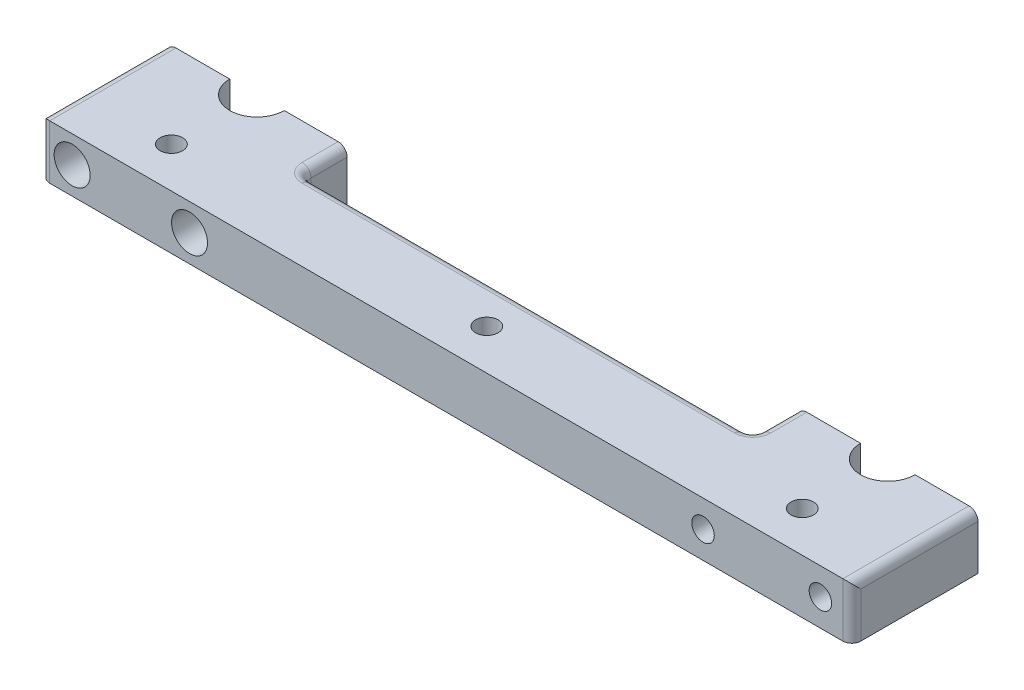
ISO-10303-21;
HEADER;
FILE_DESCRIPTION(('STEP AP214'),'2;1');
FILE_NAME('part.step','',(''),(''),'','','');
FILE_SCHEMA(('AUTOMOTIVE_DESIGN { 1 0 10303 214 1 1 1 1 }'));
ENDSEC;
DATA;
#1=APPLICATION_CONTEXT('core data for automotive mechanical design processes');
#2=APPLICATION_PROTOCOL_DEFINITION('international standard','automotive_design',2000,#1);
#3=PRODUCT_CONTEXT('',#1,'mechanical');
#4=PRODUCT('Part','Part','',(#3));
#5=PRODUCT_RELATED_PRODUCT_CATEGORY('part','',(#4));
#6=PRODUCT_DEFINITION_FORMATION('','',#4);
#7=PRODUCT_DEFINITION_CONTEXT('part definition',#1,'design');
#8=PRODUCT_DEFINITION('design','',#6,#7);
#9=PRODUCT_DEFINITION_SHAPE('','',#8);
#10=(LENGTH_UNIT() NAMED_UNIT(*) SI_UNIT(.MILLI.,.METRE.));
#11=(NAMED_UNIT(*) PLANE_ANGLE_UNIT() SI_UNIT($,.RADIAN.));
#12=(NAMED_UNIT(*) SI_UNIT($,.STERADIAN.) SOLID_ANGLE_UNIT());
#13=UNCERTAINTY_MEASURE_WITH_UNIT(LENGTH_MEASURE(1.E-05),#10,'distance_accuracy_value','');
#14=(GEOMETRIC_REPRESENTATION_CONTEXT(3) GLOBAL_UNCERTAINTY_ASSIGNED_CONTEXT((#13)) GLOBAL_UNIT_ASSIGNED_CONTEXT((#10,
#11,#12)) REPRESENTATION_CONTEXT('',''));
#15=CARTESIAN_POINT('',(0.,0.,0.));
#16=DIRECTION('',(0.,0.,1.));
#17=DIRECTION('',(1.,0.,0.));
#18=AXIS2_PLACEMENT_3D('',#15,#16,#17);
#19=CARTESIAN_POINT('',(8.04453515147499,0.,-47.4021185238704));
#20=DIRECTION('',(0.,0.,1.));
#21=DIRECTION('',(-1.,0.,0.));
#22=AXIS2_PLACEMENT_3D('',#19,#20,#21);
#23=PLANE('',#22);
#24=CARTESIAN_POINT('',(87.0472675757375,6.,-47.4021185238704));
#25=DIRECTION('',(0.,0.,1.));
#26=DIRECTION('',(1.,0.,0.));
#27=AXIS2_PLACEMENT_3D('',#24,#25,#26);
#28=CIRCLE('',#27,2.5);
#29=CARTESIAN_POINT('',(89.5472675757375,6.,-47.4021185238704));
#30=VERTEX_POINT('',#29);
#31=EDGE_CURVE('E387',#30,#30,#28,.T.);
#32=ORIENTED_EDGE('',*,*,#31,.T.);
#33=EDGE_LOOP('',(#32));
#34=FACE_BOUND('',#33,.T.);
#35=DIRECTION('',(-1.,0.,0.));
#36=VECTOR('',#35,1.);
#37=CARTESIAN_POINT('',(94.0222675757375,12.,-47.4021185238704));
#38=LINE('',#37,#36);
#39=CARTESIAN_POINT('',(92.0222675757375,12.,-47.4021185238704));
#40=VERTEX_POINT('',#39);
#41=CARTESIAN_POINT('',(80.0722675757375,12.,-47.4021185238704));
#42=VERTEX_POINT('',#41);
#43=EDGE_CURVE('E198',#40,#42,#38,.T.);
#44=ORIENTED_EDGE('',*,*,#43,.F.);
#45=CARTESIAN_POINT('',(92.0222675757375,10.,-47.4021185238704));
#46=DIRECTION('',(0.,0.,1.));
#47=DIRECTION('',(1.,0.,0.));
#48=AXIS2_PLACEMENT_3D('',#45,#46,#47);
#49=CIRCLE('',#48,2.);
#50=CARTESIAN_POINT('',(94.0222675757375,10.,-47.4021185238704));
#51=VERTEX_POINT('',#50);
#52=EDGE_CURVE('E304',#40,#51,#49,.F.);
#53=ORIENTED_EDGE('',*,*,#52,.T.);
#54=DIRECTION('',(0.,1.,0.));
#55=VECTOR('',#54,1.);
#56=CARTESIAN_POINT('',(94.0222675757375,12.,-47.4021185238704));
#57=LINE('',#56,#55);
#58=CARTESIAN_POINT('',(94.0222675757375,0.,-47.4021185238704));
#59=VERTEX_POINT('',#58);
#60=EDGE_CURVE('E377',#59,#51,#57,.T.);
#61=ORIENTED_EDGE('',*,*,#60,.F.);
#62=DIRECTION('',(1.,0.,0.));
#63=VECTOR('',#62,1.);
#64=CARTESIAN_POINT('',(94.0222675757375,0.,-47.4021185238704));
#65=LINE('',#64,#63);
#66=CARTESIAN_POINT('',(80.0722675757375,0.,-47.4021185238704));
#67=VERTEX_POINT('',#66);
#68=EDGE_CURVE('E374',#67,#59,#65,.T.);
#69=ORIENTED_EDGE('',*,*,#68,.F.);
#70=DIRECTION('',(0.,1.,0.));
#71=VECTOR('',#70,1.);
#72=CARTESIAN_POINT('',(80.0722675757375,0.,-47.4021185238704));
#73=LINE('',#72,#71);
#74=EDGE_CURVE('E186',#42,#67,#73,.F.);
#75=ORIENTED_EDGE('',*,*,#74,.F.);
#76=EDGE_LOOP('',(#44,#53,#61,#69,#75));
#77=FACE_BOUND('',#76,.T.);
#78=ADVANCED_FACE('F35',(#34,#77),#23,.F.);
#79=CARTESIAN_POINT('',(60.9972675757375,6.,-47.4021185238704));
#80=DIRECTION('',(0.,0.,1.));
#81=DIRECTION('',(1.,0.,0.));
#82=AXIS2_PLACEMENT_3D('',#79,#80,#81);
#83=CIRCLE('',#82,2.5);
#84=CARTESIAN_POINT('',(63.4972675757375,6.,-47.4021185238704));
#85=VERTEX_POINT('',#84);
#86=EDGE_CURVE('E381',#85,#85,#83,.T.);
#87=ORIENTED_EDGE('',*,*,#86,.T.);
#88=EDGE_LOOP('',(#87));
#89=FACE_BOUND('',#88,.T.);
#90=DIRECTION('',(0.,-1.,0.));
#91=VECTOR('',#90,1.);
#92=CARTESIAN_POINT('',(54.0222675757375,12.,-47.4021185238704));
#93=LINE('',#92,#91);
#94=CARTESIAN_POINT('',(54.0222675757375,10.,-47.4021185238704));
#95=VERTEX_POINT('',#94);
#96=CARTESIAN_POINT('',(54.0222675757375,0.,-47.4021185238704));
#97=VERTEX_POINT('',#96);
#98=EDGE_CURVE('E205',#95,#97,#93,.T.);
#99=ORIENTED_EDGE('',*,*,#98,.F.);
#100=CARTESIAN_POINT('',(56.0222675757375,10.,-47.4021185238704));
#101=DIRECTION('',(0.,0.,1.));
#102=DIRECTION('',(1.,0.,0.));
#103=AXIS2_PLACEMENT_3D('',#100,#101,#102);
#104=CIRCLE('',#103,2.);
#105=CARTESIAN_POINT('',(56.0222675757375,12.,-47.4021185238704));
#106=VERTEX_POINT('',#105);
#107=EDGE_CURVE('E204',#95,#106,#104,.F.);
#108=ORIENTED_EDGE('',*,*,#107,.T.);
#109=CARTESIAN_POINT('',(67.9722675757375,12.,-47.4021185238704));
#110=VERTEX_POINT('',#109);
#111=EDGE_CURVE('E194',#110,#106,#38,.T.);
#112=ORIENTED_EDGE('',*,*,#111,.F.);
#113=DIRECTION('',(0.,1.,0.));
#114=VECTOR('',#113,1.);
#115=CARTESIAN_POINT('',(67.9722675757375,0.,-47.4021185238704));
#116=LINE('',#115,#114);
#117=CARTESIAN_POINT('',(67.9722675757375,0.,-47.4021185238704));
#118=VERTEX_POINT('',#117);
#119=EDGE_CURVE('E175',#118,#110,#116,.T.);
#120=ORIENTED_EDGE('',*,*,#119,.F.);
#121=EDGE_CURVE('E208',#97,#118,#65,.T.);
#122=ORIENTED_EDGE('',*,*,#121,.F.);
#123=EDGE_LOOP('',(#99,#108,#112,#120,#122));
#124=FACE_BOUND('',#123,.T.);
#125=ADVANCED_FACE('F202',(#89,#124),#23,.F.);
#126=CARTESIAN_POINT('',(-79.0027324242625,6.,-19.4021185238704));
#127=DIRECTION('',(0.,0.,-1.));
#128=DIRECTION('',(-1.,0.,0.));
#129=AXIS2_PLACEMENT_3D('',#126,#127,#128);
#130=CYLINDRICAL_SURFACE('',#129,2.5);
#131=CARTESIAN_POINT('',(-79.0027324242625,6.,-47.4021185238704));
#132=DIRECTION('',(0.,0.,-1.));
#133=DIRECTION('',(-1.,0.,0.));
#134=AXIS2_PLACEMENT_3D('',#131,#132,#133);
#135=CIRCLE('',#134,2.5);
#136=CARTESIAN_POINT('',(-81.5027324242625,6.,-47.4021185238704));
#137=VERTEX_POINT('',#136);
#138=EDGE_CURVE('E228',#137,#137,#135,.T.);
#139=ORIENTED_EDGE('',*,*,#138,.T.);
#140=EDGE_LOOP('',(#139));
#141=FACE_BOUND('',#140,.T.);
#142=CARTESIAN_POINT('',(-79.0027324242625,6.,-31.4021185238704));
#143=DIRECTION('',(0.,0.,1.));
#144=DIRECTION('',(1.,0.,0.));
#145=AXIS2_PLACEMENT_3D('',#142,#143,#144);
#146=CIRCLE('',#145,2.5);
#147=CARTESIAN_POINT('',(-76.5027324242625,6.,-31.4021185238704));
#148=VERTEX_POINT('',#147);
#149=EDGE_CURVE('E218',#148,#148,#146,.F.);
#150=ORIENTED_EDGE('',*,*,#149,.F.);
#151=EDGE_LOOP('',(#150));
#152=FACE_BOUND('',#151,.T.);
#153=ADVANCED_FACE('F449',(#141,#152),#130,.F.);
#154=CARTESIAN_POINT('',(-52.9527324242625,6.,-19.4021185238704));
#155=DIRECTION('',(0.,0.,-1.));
#156=DIRECTION('',(-1.,0.,0.));
#157=AXIS2_PLACEMENT_3D('',#154,#155,#156);
#158=CYLINDRICAL_SURFACE('',#157,2.5);
#159=CARTESIAN_POINT('',(-52.9527324242625,6.,-47.4021185238704));
#160=DIRECTION('',(0.,0.,-1.));
#161=DIRECTION('',(-1.,0.,0.));
#162=AXIS2_PLACEMENT_3D('',#159,#160,#161);
#163=CIRCLE('',#162,2.5);
#164=CARTESIAN_POINT('',(-55.4527324242625,6.,-47.4021185238704));
#165=VERTEX_POINT('',#164);
#166=EDGE_CURVE('E231',#165,#165,#163,.T.);
#167=ORIENTED_EDGE('',*,*,#166,.T.);
#168=EDGE_LOOP('',(#167));
#169=FACE_BOUND('',#168,.T.);
#170=CARTESIAN_POINT('',(-52.9527324242625,6.,-31.4021185238704));
#171=DIRECTION('',(0.,0.,1.));
#172=DIRECTION('',(1.,0.,0.));
#173=AXIS2_PLACEMENT_3D('',#170,#171,#172);
#174=CIRCLE('',#173,2.5);
#175=CARTESIAN_POINT('',(-50.4527324242625,6.,-31.4021185238704));
#176=VERTEX_POINT('',#175);
#177=EDGE_CURVE('E224',#176,#176,#174,.F.);
#178=ORIENTED_EDGE('',*,*,#177,.F.);
#179=EDGE_LOOP('',(#178));
#180=FACE_BOUND('',#179,.T.);
#181=ADVANCED_FACE('F477',(#169,#180),#158,.F.);
#182=CARTESIAN_POINT('',(0.,0.,-47.4021185238704));
#183=DIRECTION('',(0.,0.,1.));
#184=DIRECTION('',(1.,0.,0.));
#185=AXIS2_PLACEMENT_3D('',#182,#183,#184);
#186=PLANE('',#185);
#187=ORIENTED_EDGE('',*,*,#166,.F.);
#188=EDGE_LOOP('',(#187));
#189=FACE_BOUND('',#188,.T.);
#190=DIRECTION('',(1.,0.,0.));
#191=VECTOR('',#190,1.);
#192=CARTESIAN_POINT('',(-85.9777324242625,12.,-47.4021185238704));
#193=LINE('',#192,#191);
#194=CARTESIAN_POINT('',(-59.9277324242625,12.,-47.4021185238704));
#195=VERTEX_POINT('',#194);
#196=CARTESIAN_POINT('',(-47.9777324242625,12.,-47.4021185238704));
#197=VERTEX_POINT('',#196);
#198=EDGE_CURVE('E242',#195,#197,#193,.T.);
#199=ORIENTED_EDGE('',*,*,#198,.T.);
#200=CARTESIAN_POINT('',(-47.9777324242625,10.,-47.4021185238704));
#201=DIRECTION('',(0.,0.,1.));
#202=DIRECTION('',(1.,0.,0.));
#203=AXIS2_PLACEMENT_3D('',#200,#201,#202);
#204=CIRCLE('',#203,2.);
#205=CARTESIAN_POINT('',(-45.9777324242625,10.,-47.4021185238704));
#206=VERTEX_POINT('',#205);
#207=EDGE_CURVE('E314',#197,#206,#204,.F.);
#208=ORIENTED_EDGE('',*,*,#207,.T.);
#209=DIRECTION('',(0.,-1.,0.));
#210=VECTOR('',#209,1.);
#211=CARTESIAN_POINT('',(-45.9777324242625,12.,-47.4021185238704));
#212=LINE('',#211,#210);
#213=CARTESIAN_POINT('',(-45.9777324242625,0.,-47.4021185238704));
#214=VERTEX_POINT('',#213);
#215=EDGE_CURVE('E245',#206,#214,#212,.T.);
#216=ORIENTED_EDGE('',*,*,#215,.T.);
#217=DIRECTION('',(-1.,0.,0.));
#218=VECTOR('',#217,1.);
#219=CARTESIAN_POINT('',(-85.9777324242625,0.,-47.4021185238704));
#220=LINE('',#219,#218);
#221=CARTESIAN_POINT('',(-59.9277324242625,0.,-47.4021185238704));
#222=VERTEX_POINT('',#221);
#223=EDGE_CURVE('E248',#214,#222,#220,.T.);
#224=ORIENTED_EDGE('',*,*,#223,.T.);
#225=DIRECTION('',(0.,1.,0.));
#226=VECTOR('',#225,1.);
#227=CARTESIAN_POINT('',(-59.9277324242625,0.,-47.4021185238704));
#228=LINE('',#227,#226);
#229=EDGE_CURVE('E187',#222,#195,#228,.T.);
#230=ORIENTED_EDGE('',*,*,#229,.T.);
#231=EDGE_LOOP('',(#199,#208,#216,#224,#230));
#232=FACE_BOUND('',#231,.T.);
#233=ADVANCED_FACE('F481',(#189,#232),#186,.F.);
#234=CARTESIAN_POINT('',(-85.9777324242625,12.,-37.4021185238704));
#235=DIRECTION('',(0.,0.,1.));
#236=DIRECTION('',(1.,0.,0.));
#237=AXIS2_PLACEMENT_3D('',#234,#235,#236);
#238=PLANE('',#237);
#239=DIRECTION('',(-1.,0.,0.));
#240=VECTOR('',#239,1.);
#241=CARTESIAN_POINT('',(-85.9777324242625,0.,-37.4021185238704));
#242=LINE('',#241,#240);
#243=CARTESIAN_POINT('',(52.0222675757374,0.,-37.4021185238704));
#244=VERTEX_POINT('',#243);
#245=CARTESIAN_POINT('',(-43.9777324242625,0.,-37.4021185238704));
#246=VERTEX_POINT('',#245);
#247=EDGE_CURVE('E258',#244,#246,#242,.T.);
#248=ORIENTED_EDGE('',*,*,#247,.T.);
#249=DIRECTION('',(0.,-1.,0.));
#250=VECTOR('',#249,1.);
#251=CARTESIAN_POINT('',(-43.9777324242625,12.,-37.4021185238704));
#252=LINE('',#251,#250);
#253=CARTESIAN_POINT('',(-43.9777324242625,10.,-37.4021185238704));
#254=VERTEX_POINT('',#253);
#255=EDGE_CURVE('E302',#246,#254,#252,.F.);
#256=ORIENTED_EDGE('',*,*,#255,.T.);
#257=DIRECTION('',(-1.,0.,0.));
#258=VECTOR('',#257,1.);
#259=CARTESIAN_POINT('',(-85.9777324242625,10.,-37.4021185238704));
#260=LINE('',#259,#258);
#261=CARTESIAN_POINT('',(52.0222675757375,10.,-37.4021185238704));
#262=VERTEX_POINT('',#261);
#263=EDGE_CURVE('E300',#254,#262,#260,.F.);
#264=ORIENTED_EDGE('',*,*,#263,.T.);
#265=DIRECTION('',(0.,-1.,0.));
#266=VECTOR('',#265,1.);
#267=CARTESIAN_POINT('',(52.0222675757375,12.0000000000001,-37.4021185238704));
#268=LINE('',#267,#266);
#269=EDGE_CURVE('E298',#262,#244,#268,.T.);
#270=ORIENTED_EDGE('',*,*,#269,.T.);
#271=EDGE_LOOP('',(#248,#256,#264,#270));
#272=FACE_BOUND('',#271,.T.);
#273=ADVANCED_FACE('F496',(#272),#238,.F.);
#274=CARTESIAN_POINT('',(-85.9777324242625,12.,-19.4021185238704));
#275=DIRECTION('',(1.,0.,0.));
#276=DIRECTION('',(0.,0.,-1.));
#277=AXIS2_PLACEMENT_3D('',#274,#275,#276);
#278=PLANE('',#277);
#279=DIRECTION('',(0.,-1.,0.));
#280=VECTOR('',#279,1.);
#281=CARTESIAN_POINT('',(-85.9777324242625,12.,-21.4021185238704));
#282=LINE('',#281,#280);
#283=CARTESIAN_POINT('',(-85.9777324242625,0.,-21.4021185238704));
#284=VERTEX_POINT('',#283);
#285=CARTESIAN_POINT('',(-85.9777324242625,10.,-21.4021185238704));
#286=VERTEX_POINT('',#285);
#287=EDGE_CURVE('E316',#284,#286,#282,.F.);
#288=ORIENTED_EDGE('',*,*,#287,.T.);
#289=DIRECTION('',(0.,0.,1.));
#290=VECTOR('',#289,1.);
#291=CARTESIAN_POINT('',(-85.9777324242625,10.,-19.4021185238704));
#292=LINE('',#291,#290);
#293=CARTESIAN_POINT('',(-85.9777324242625,10.,-47.4021185238704));
#294=VERTEX_POINT('',#293);
#295=EDGE_CURVE('E318',#286,#294,#292,.F.);
#296=ORIENTED_EDGE('',*,*,#295,.T.);
#297=DIRECTION('',(0.,1.,0.));
#298=VECTOR('',#297,1.);
#299=CARTESIAN_POINT('',(-85.9777324242625,12.,-47.4021185238704));
#300=LINE('',#299,#298);
#301=CARTESIAN_POINT('',(-85.9777324242625,0.,-47.4021185238704));
#302=VERTEX_POINT('',#301);
#303=EDGE_CURVE('E238',#302,#294,#300,.T.);
#304=ORIENTED_EDGE('',*,*,#303,.F.);
#305=DIRECTION('',(0.,0.,1.));
#306=VECTOR('',#305,1.);
#307=CARTESIAN_POINT('',(-85.9777324242625,0.,-19.4021185238704));
#308=LINE('',#307,#306);
#309=EDGE_CURVE('E254',#302,#284,#308,.T.);
#310=ORIENTED_EDGE('',*,*,#309,.T.);
#311=EDGE_LOOP('',(#288,#296,#304,#310));
#312=FACE_BOUND('',#311,.T.);
#313=ADVANCED_FACE('F499',(#312),#278,.F.);
#314=CARTESIAN_POINT('',(-85.9777324242625,12.,-19.4021185238704));
#315=DIRECTION('',(0.,0.,-1.));
#316=DIRECTION('',(-1.,0.,0.));
#317=AXIS2_PLACEMENT_3D('',#314,#315,#316);
#318=PLANE('',#317);
#319=CARTESIAN_POINT('',(87.0472675757375,6.,-19.4021185238704));
#320=DIRECTION('',(0.,0.,1.));
#321=DIRECTION('',(1.,0.,0.));
#322=AXIS2_PLACEMENT_3D('',#319,#320,#321);
#323=CIRCLE('',#322,2.5);
#324=CARTESIAN_POINT('',(89.5472675757375,6.,-19.4021185238704));
#325=VERTEX_POINT('',#324);
#326=EDGE_CURVE('E384',#325,#325,#323,.T.);
#327=ORIENTED_EDGE('',*,*,#326,.F.);
#328=EDGE_LOOP('',(#327));
#329=FACE_BOUND('',#328,.T.);
#330=CARTESIAN_POINT('',(60.9972675757375,6.,-19.4021185238704));
#331=DIRECTION('',(0.,0.,1.));
#332=DIRECTION('',(1.,0.,0.));
#333=AXIS2_PLACEMENT_3D('',#330,#331,#332);
#334=CIRCLE('',#333,2.5);
#335=CARTESIAN_POINT('',(63.4972675757375,6.,-19.4021185238704));
#336=VERTEX_POINT('',#335);
#337=EDGE_CURVE('E199',#336,#336,#334,.T.);
#338=ORIENTED_EDGE('',*,*,#337,.F.);
#339=EDGE_LOOP('',(#338));
#340=FACE_BOUND('',#339,.T.);
#341=CARTESIAN_POINT('',(-79.0027324242625,6.,-19.4021185238704));
#342=DIRECTION('',(0.,0.,1.));
#343=DIRECTION('',(1.,0.,0.));
#344=AXIS2_PLACEMENT_3D('',#341,#342,#343);
#345=CIRCLE('',#344,4.00000000000001);
#346=CARTESIAN_POINT('',(-75.0027324242625,6.,-19.4021185238704));
#347=VERTEX_POINT('',#346);
#348=EDGE_CURVE('E214',#347,#347,#345,.T.);
#349=ORIENTED_EDGE('',*,*,#348,.F.);
#350=EDGE_LOOP('',(#349));
#351=FACE_BOUND('',#350,.T.);
#352=CARTESIAN_POINT('',(-52.9527324242625,6.,-19.4021185238704));
#353=DIRECTION('',(0.,0.,1.));
#354=DIRECTION('',(1.,0.,0.));
#355=AXIS2_PLACEMENT_3D('',#352,#353,#354);
#356=CIRCLE('',#355,4.00000000000001);
#357=CARTESIAN_POINT('',(-48.9527324242625,6.,-19.4021185238704));
#358=VERTEX_POINT('',#357);
#359=EDGE_CURVE('E225',#358,#358,#356,.T.);
#360=ORIENTED_EDGE('',*,*,#359,.F.);
#361=EDGE_LOOP('',(#360));
#362=FACE_BOUND('',#361,.T.);
#363=DIRECTION('',(1.,0.,0.));
#364=VECTOR('',#363,1.);
#365=CARTESIAN_POINT('',(-85.9777324242625,0.,-19.4021185238704));
#366=LINE('',#365,#364);
#367=CARTESIAN_POINT('',(-83.9777324242625,0.,-19.4021185238704));
#368=VERTEX_POINT('',#367);
#369=CARTESIAN_POINT('',(92.0222675757375,0.,-19.4021185238704));
#370=VERTEX_POINT('',#369);
#371=EDGE_CURVE('E261',#368,#370,#366,.T.);
#372=ORIENTED_EDGE('',*,*,#371,.T.);
#373=DIRECTION('',(0.,-1.,0.));
#374=VECTOR('',#373,1.);
#375=CARTESIAN_POINT('',(92.0222675757375,12.,-19.4021185238704));
#376=LINE('',#375,#374);
#377=CARTESIAN_POINT('',(92.0222675757375,12.,-19.4021185238704));
#378=VERTEX_POINT('',#377);
#379=EDGE_CURVE('E326',#370,#378,#376,.F.);
#380=ORIENTED_EDGE('',*,*,#379,.T.);
#381=DIRECTION('',(1.,0.,0.));
#382=VECTOR('',#381,1.);
#383=CARTESIAN_POINT('',(-85.9777324242625,12.,-19.4021185238704));
#384=LINE('',#383,#382);
#385=CARTESIAN_POINT('',(-83.9777324242625,12.,-19.4021185238704));
#386=VERTEX_POINT('',#385);
#387=EDGE_CURVE('E255',#386,#378,#384,.T.);
#388=ORIENTED_EDGE('',*,*,#387,.F.);
#389=DIRECTION('',(0.,-1.,0.));
#390=VECTOR('',#389,1.);
#391=CARTESIAN_POINT('',(-83.9777324242625,12.,-19.4021185238704));
#392=LINE('',#391,#390);
#393=EDGE_CURVE('E59',#386,#368,#392,.T.);
#394=ORIENTED_EDGE('',*,*,#393,.T.);
#395=EDGE_LOOP('',(#372,#380,#388,#394));
#396=FACE_BOUND('',#395,.T.);
#397=ADVANCED_FACE('F363',(#329,#340,#351,#362,#396),#318,.F.);
#398=CARTESIAN_POINT('',(94.0222675757375,12.,-19.4021185238704));
#399=DIRECTION('',(-1.,0.,0.));
#400=DIRECTION('',(0.,0.,1.));
#401=AXIS2_PLACEMENT_3D('',#398,#399,#400);
#402=PLANE('',#401);
#403=ORIENTED_EDGE('',*,*,#60,.T.);
#404=DIRECTION('',(0.,0.,-1.));
#405=VECTOR('',#404,1.);
#406=CARTESIAN_POINT('',(94.0222675757375,10.,-19.4021185238704));
#407=LINE('',#406,#405);
#408=CARTESIAN_POINT('',(94.0222675757375,10.,-21.4021185238704));
#409=VERTEX_POINT('',#408);
#410=EDGE_CURVE('E308',#51,#409,#407,.F.);
#411=ORIENTED_EDGE('',*,*,#410,.T.);
#412=DIRECTION('',(0.,-1.,0.));
#413=VECTOR('',#412,1.);
#414=CARTESIAN_POINT('',(94.0222675757375,12.,-21.4021185238704));
#415=LINE('',#414,#413);
#416=CARTESIAN_POINT('',(94.0222675757375,0.,-21.4021185238704));
#417=VERTEX_POINT('',#416);
#418=EDGE_CURVE('E306',#409,#417,#415,.T.);
#419=ORIENTED_EDGE('',*,*,#418,.T.);
#420=DIRECTION('',(0.,0.,-1.));
#421=VECTOR('',#420,1.);
#422=CARTESIAN_POINT('',(94.0222675757375,0.,-19.4021185238704));
#423=LINE('',#422,#421);
#424=EDGE_CURVE('E263',#417,#59,#423,.T.);
#425=ORIENTED_EDGE('',*,*,#424,.T.);
#426=EDGE_LOOP('',(#403,#411,#419,#425));
#427=FACE_BOUND('',#426,.T.);
#428=ADVANCED_FACE('F422',(#427),#402,.F.);
#429=CARTESIAN_POINT('',(0.,12.,0.));
#430=DIRECTION('',(0.,-1.,0.));
#431=DIRECTION('',(0.,0.,-1.));
#432=AXIS2_PLACEMENT_3D('',#429,#430,#431);
#433=PLANE('',#432);
#434=CARTESIAN_POINT('',(74.0222675757375,12.,-28.4021185238704));
#435=DIRECTION('',(0.,1.,0.));
#436=DIRECTION('',(0.,0.,1.));
#437=AXIS2_PLACEMENT_3D('',#434,#435,#436);
#438=CIRCLE('',#437,2.5);
#439=CARTESIAN_POINT('',(74.0222675757375,12.,-25.9021185238704));
#440=VERTEX_POINT('',#439);
#441=EDGE_CURVE('E404',#440,#440,#438,.T.);
#442=ORIENTED_EDGE('',*,*,#441,.F.);
#443=EDGE_LOOP('',(#442));
#444=FACE_BOUND('',#443,.T.);
#445=CARTESIAN_POINT('',(-65.9777324242625,12.,-28.4021185238704));
#446=DIRECTION('',(0.,1.,0.));
#447=DIRECTION('',(0.,0.,1.));
#448=AXIS2_PLACEMENT_3D('',#445,#446,#447);
#449=CIRCLE('',#448,2.5);
#450=CARTESIAN_POINT('',(-65.9777324242625,12.,-25.9021185238704));
#451=VERTEX_POINT('',#450);
#452=EDGE_CURVE('E346',#451,#451,#449,.T.);
#453=ORIENTED_EDGE('',*,*,#452,.F.);
#454=EDGE_LOOP('',(#453));
#455=FACE_BOUND('',#454,.T.);
#456=CARTESIAN_POINT('',(4.02226757573752,12.,-28.4021185238704));
#457=DIRECTION('',(0.,1.,0.));
#458=DIRECTION('',(0.,0.,1.));
#459=AXIS2_PLACEMENT_3D('',#456,#457,#458);
#460=CIRCLE('',#459,2.5);
#461=CARTESIAN_POINT('',(4.02226757573752,12.,-25.9021185238704));
#462=VERTEX_POINT('',#461);
#463=EDGE_CURVE('E393',#462,#462,#460,.T.);
#464=ORIENTED_EDGE('',*,*,#463,.F.);
#465=EDGE_LOOP('',(#464));
#466=FACE_BOUND('',#465,.T.);
#467=ORIENTED_EDGE('',*,*,#387,.T.);
#468=DIRECTION('',(0.,0.,-1.));
#469=VECTOR('',#468,1.);
#470=CARTESIAN_POINT('',(92.0222675757375,12.,0.));
#471=LINE('',#470,#469);
#472=EDGE_CURVE('E291',#378,#40,#471,.T.);
#473=ORIENTED_EDGE('',*,*,#472,.T.);
#474=ORIENTED_EDGE('',*,*,#43,.T.);
#475=CARTESIAN_POINT('',(74.0222675757375,12.,-47.4021185238704));
#476=DIRECTION('',(0.,-1.,0.));
#477=DIRECTION('',(0.,0.,1.));
#478=AXIS2_PLACEMENT_3D('',#475,#476,#477);
#479=CIRCLE('',#478,6.05);
#480=EDGE_CURVE('E178',#42,#110,#479,.T.);
#481=ORIENTED_EDGE('',*,*,#480,.T.);
#482=ORIENTED_EDGE('',*,*,#111,.T.);
#483=DIRECTION('',(0.,0.,1.));
#484=VECTOR('',#483,1.);
#485=CARTESIAN_POINT('',(56.0222675757375,12.,-37.4021185238704));
#486=LINE('',#485,#484);
#487=CARTESIAN_POINT('',(56.0222675757375,12.,-39.4021185238704));
#488=VERTEX_POINT('',#487);
#489=EDGE_CURVE('E289',#106,#488,#486,.T.);
#490=ORIENTED_EDGE('',*,*,#489,.T.);
#491=CARTESIAN_POINT('',(52.0222675757375,12.,-39.4021185238704));
#492=DIRECTION('',(0.,-1.,0.));
#493=DIRECTION('',(0.,0.,-1.));
#494=AXIS2_PLACEMENT_3D('',#491,#492,#493);
#495=CIRCLE('',#494,4.);
#496=CARTESIAN_POINT('',(52.0222675757375,12.,-35.4021185238704));
#497=VERTEX_POINT('',#496);
#498=EDGE_CURVE('E286',#497,#488,#495,.F.);
#499=ORIENTED_EDGE('',*,*,#498,.F.);
#500=DIRECTION('',(-1.,0.,0.));
#501=VECTOR('',#500,1.);
#502=CARTESIAN_POINT('',(0.,12.,-35.4021185238704));
#503=LINE('',#502,#501);
#504=CARTESIAN_POINT('',(-43.9777324242625,12.,-35.4021185238704));
#505=VERTEX_POINT('',#504);
#506=EDGE_CURVE('E284',#497,#505,#503,.T.);
#507=ORIENTED_EDGE('',*,*,#506,.T.);
#508=CARTESIAN_POINT('',(-43.9777324242625,12.,-39.4021185238704));
#509=DIRECTION('',(0.,-1.,0.));
#510=DIRECTION('',(0.,0.,-1.));
#511=AXIS2_PLACEMENT_3D('',#508,#509,#510);
#512=CIRCLE('',#511,4.);
#513=CARTESIAN_POINT('',(-47.9777324242625,12.,-39.4021185238704));
#514=VERTEX_POINT('',#513);
#515=EDGE_CURVE('E281',#514,#505,#512,.F.);
#516=ORIENTED_EDGE('',*,*,#515,.F.);
#517=DIRECTION('',(0.,0.,1.));
#518=VECTOR('',#517,1.);
#519=CARTESIAN_POINT('',(-47.9777324242625,12.,0.));
#520=LINE('',#519,#518);
#521=EDGE_CURVE('E279',#514,#197,#520,.F.);
#522=ORIENTED_EDGE('',*,*,#521,.T.);
#523=ORIENTED_EDGE('',*,*,#198,.F.);
#524=CARTESIAN_POINT('',(-65.9777324242625,12.,-47.4021185238704));
#525=DIRECTION('',(0.,1.,0.));
#526=DIRECTION('',(0.,0.,1.));
#527=AXIS2_PLACEMENT_3D('',#524,#525,#526);
#528=CIRCLE('',#527,6.05);
#529=CARTESIAN_POINT('',(-72.0277324242625,12.,-47.4021185238704));
#530=VERTEX_POINT('',#529);
#531=EDGE_CURVE('E234',#530,#195,#528,.T.);
#532=ORIENTED_EDGE('',*,*,#531,.F.);
#533=CARTESIAN_POINT('',(-83.9777324242625,12.,-47.4021185238704));
#534=VERTEX_POINT('',#533);
#535=EDGE_CURVE('E243',#534,#530,#193,.T.);
#536=ORIENTED_EDGE('',*,*,#535,.F.);
#537=DIRECTION('',(0.,0.,1.));
#538=VECTOR('',#537,1.);
#539=CARTESIAN_POINT('',(-83.9777324242625,12.,0.));
#540=LINE('',#539,#538);
#541=EDGE_CURVE('E276',#534,#386,#540,.T.);
#542=ORIENTED_EDGE('',*,*,#541,.T.);
#543=EDGE_LOOP('',(#467,#473,#474,#481,#482,#490,#499,#507,#516,#522,#523,#532,#536,#542));
#544=FACE_BOUND('',#543,.T.);
#545=ADVANCED_FACE('F192',(#444,#455,#466,#544),#433,.F.);
#546=CARTESIAN_POINT('',(0.,0.,0.));
#547=DIRECTION('',(0.,-1.,0.));
#548=DIRECTION('',(0.,0.,-1.));
#549=AXIS2_PLACEMENT_3D('',#546,#547,#548);
#550=PLANE('',#549);
#551=CARTESIAN_POINT('',(74.0222675757375,0.,-28.4021185238704));
#552=DIRECTION('',(0.,1.,0.));
#553=DIRECTION('',(0.,0.,1.));
#554=AXIS2_PLACEMENT_3D('',#551,#552,#553);
#555=CIRCLE('',#554,2.5);
#556=CARTESIAN_POINT('',(74.0222675757375,0.,-25.9021185238704));
#557=VERTEX_POINT('',#556);
#558=EDGE_CURVE('E396',#557,#557,#555,.T.);
#559=ORIENTED_EDGE('',*,*,#558,.T.);
#560=EDGE_LOOP('',(#559));
#561=FACE_BOUND('',#560,.T.);
#562=CARTESIAN_POINT('',(-65.9777324242625,0.,-28.4021185238704));
#563=DIRECTION('',(0.,1.,0.));
#564=DIRECTION('',(0.,0.,1.));
#565=AXIS2_PLACEMENT_3D('',#562,#563,#564);
#566=CIRCLE('',#565,2.5);
#567=CARTESIAN_POINT('',(-65.9777324242625,0.,-25.9021185238704));
#568=VERTEX_POINT('',#567);
#569=EDGE_CURVE('E401',#568,#568,#566,.T.);
#570=ORIENTED_EDGE('',*,*,#569,.T.);
#571=EDGE_LOOP('',(#570));
#572=FACE_BOUND('',#571,.T.);
#573=CARTESIAN_POINT('',(4.02226757573752,0.,-28.4021185238704));
#574=DIRECTION('',(0.,1.,0.));
#575=DIRECTION('',(0.,0.,1.));
#576=AXIS2_PLACEMENT_3D('',#573,#574,#575);
#577=CIRCLE('',#576,2.5);
#578=CARTESIAN_POINT('',(4.02226757573752,0.,-25.9021185238704));
#579=VERTEX_POINT('',#578);
#580=EDGE_CURVE('E390',#579,#579,#577,.T.);
#581=ORIENTED_EDGE('',*,*,#580,.T.);
#582=EDGE_LOOP('',(#581));
#583=FACE_BOUND('',#582,.T.);
#584=ORIENTED_EDGE('',*,*,#424,.F.);
#585=CARTESIAN_POINT('',(92.0222675757375,0.,-21.4021185238704));
#586=DIRECTION('',(0.,-1.,0.));
#587=DIRECTION('',(0.,0.,-1.));
#588=AXIS2_PLACEMENT_3D('',#585,#586,#587);
#589=CIRCLE('',#588,2.);
#590=EDGE_CURVE('E52',#417,#370,#589,.T.);
#591=ORIENTED_EDGE('',*,*,#590,.T.);
#592=ORIENTED_EDGE('',*,*,#371,.F.);
#593=CARTESIAN_POINT('',(-83.9777324242625,0.,-21.4021185238704));
#594=DIRECTION('',(0.,-1.,0.));
#595=DIRECTION('',(0.,0.,-1.));
#596=AXIS2_PLACEMENT_3D('',#593,#594,#595);
#597=CIRCLE('',#596,2.);
#598=EDGE_CURVE('E322',#368,#284,#597,.T.);
#599=ORIENTED_EDGE('',*,*,#598,.T.);
#600=ORIENTED_EDGE('',*,*,#309,.F.);
#601=CARTESIAN_POINT('',(-72.0277324242625,0.,-47.4021185238704));
#602=VERTEX_POINT('',#601);
#603=EDGE_CURVE('E247',#602,#302,#220,.T.);
#604=ORIENTED_EDGE('',*,*,#603,.F.);
#605=CARTESIAN_POINT('',(-65.9777324242625,0.,-47.4021185238704));
#606=DIRECTION('',(0.,1.,0.));
#607=DIRECTION('',(0.,0.,1.));
#608=AXIS2_PLACEMENT_3D('',#605,#606,#607);
#609=CIRCLE('',#608,6.05);
#610=EDGE_CURVE('E235',#602,#222,#609,.T.);
#611=ORIENTED_EDGE('',*,*,#610,.T.);
#612=ORIENTED_EDGE('',*,*,#223,.F.);
#613=DIRECTION('',(0.,0.,1.));
#614=VECTOR('',#613,1.);
#615=CARTESIAN_POINT('',(-45.9777324242625,0.,-47.4021185238704));
#616=LINE('',#615,#614);
#617=CARTESIAN_POINT('',(-45.9777324242625,0.,-39.4021185238704));
#618=VERTEX_POINT('',#617);
#619=EDGE_CURVE('E251',#214,#618,#616,.T.);
#620=ORIENTED_EDGE('',*,*,#619,.T.);
#621=CARTESIAN_POINT('',(-43.9777324242625,0.,-39.4021185238704));
#622=DIRECTION('',(0.,-1.,0.));
#623=DIRECTION('',(0.,0.,-1.));
#624=AXIS2_PLACEMENT_3D('',#621,#622,#623);
#625=CIRCLE('',#624,2.);
#626=EDGE_CURVE('E44',#618,#246,#625,.F.);
#627=ORIENTED_EDGE('',*,*,#626,.T.);
#628=ORIENTED_EDGE('',*,*,#247,.F.);
#629=CARTESIAN_POINT('',(52.0222675757375,0.,-39.4021185238704));
#630=DIRECTION('',(0.,-1.,0.));
#631=DIRECTION('',(0.,0.,-1.));
#632=AXIS2_PLACEMENT_3D('',#629,#630,#631);
#633=CIRCLE('',#632,2.);
#634=CARTESIAN_POINT('',(54.0222675757375,0.,-39.4021185238704));
#635=VERTEX_POINT('',#634);
#636=EDGE_CURVE('E11',#244,#635,#633,.F.);
#637=ORIENTED_EDGE('',*,*,#636,.T.);
#638=DIRECTION('',(0.,0.,1.));
#639=VECTOR('',#638,1.);
#640=CARTESIAN_POINT('',(54.0222675757375,0.,-47.4021185238704));
#641=LINE('',#640,#639);
#642=EDGE_CURVE('E207',#97,#635,#641,.T.);
#643=ORIENTED_EDGE('',*,*,#642,.F.);
#644=ORIENTED_EDGE('',*,*,#121,.T.);
#645=CARTESIAN_POINT('',(74.0222675757375,0.,-47.4021185238704));
#646=DIRECTION('',(0.,-1.,0.));
#647=DIRECTION('',(0.,0.,1.));
#648=AXIS2_PLACEMENT_3D('',#645,#646,#647);
#649=CIRCLE('',#648,6.05);
#650=EDGE_CURVE('E181',#67,#118,#649,.T.);
#651=ORIENTED_EDGE('',*,*,#650,.F.);
#652=ORIENTED_EDGE('',*,*,#68,.T.);
#653=EDGE_LOOP('',(#584,#591,#592,#599,#600,#604,#611,#612,#620,#627,#628,#637,#643,#644,#651,#652));
#654=FACE_BOUND('',#653,.T.);
#655=ADVANCED_FACE('F375',(#561,#572,#583,#654),#550,.T.);
#656=CARTESIAN_POINT('',(-45.9777324242625,12.,-47.4021185238704));
#657=DIRECTION('',(-1.,0.,0.));
#658=DIRECTION('',(0.,-1.,0.));
#659=AXIS2_PLACEMENT_3D('',#656,#657,#658);
#660=PLANE('',#659);
#661=ORIENTED_EDGE('',*,*,#215,.F.);
#662=DIRECTION('',(0.,0.,1.));
#663=VECTOR('',#662,1.);
#664=CARTESIAN_POINT('',(-45.9777324242625,10.,-47.4021185238704));
#665=LINE('',#664,#663);
#666=CARTESIAN_POINT('',(-45.9777324242625,10.,-39.4021185238704));
#667=VERTEX_POINT('',#666);
#668=EDGE_CURVE('E312',#206,#667,#665,.T.);
#669=ORIENTED_EDGE('',*,*,#668,.T.);
#670=DIRECTION('',(0.,-1.,0.));
#671=VECTOR('',#670,1.);
#672=CARTESIAN_POINT('',(-45.9777324242625,0.,-39.4021185238704));
#673=LINE('',#672,#671);
#674=EDGE_CURVE('E310',#667,#618,#673,.T.);
#675=ORIENTED_EDGE('',*,*,#674,.T.);
#676=ORIENTED_EDGE('',*,*,#619,.F.);
#677=EDGE_LOOP('',(#661,#669,#675,#676));
#678=FACE_BOUND('',#677,.T.);
#679=ADVANCED_FACE('F489',(#678),#660,.F.);
#680=ORIENTED_EDGE('',*,*,#138,.F.);
#681=EDGE_LOOP('',(#680));
#682=FACE_BOUND('',#681,.T.);
#683=ORIENTED_EDGE('',*,*,#303,.T.);
#684=CARTESIAN_POINT('',(-83.9777324242625,10.,-47.4021185238704));
#685=DIRECTION('',(0.,0.,1.));
#686=DIRECTION('',(1.,0.,0.));
#687=AXIS2_PLACEMENT_3D('',#684,#685,#686);
#688=CIRCLE('',#687,2.);
#689=EDGE_CURVE('E320',#294,#534,#688,.F.);
#690=ORIENTED_EDGE('',*,*,#689,.T.);
#691=ORIENTED_EDGE('',*,*,#535,.T.);
#692=DIRECTION('',(0.,1.,0.));
#693=VECTOR('',#692,1.);
#694=CARTESIAN_POINT('',(-72.0277324242625,0.,-47.4021185238704));
#695=LINE('',#694,#693);
#696=EDGE_CURVE('E257',#530,#602,#695,.F.);
#697=ORIENTED_EDGE('',*,*,#696,.T.);
#698=ORIENTED_EDGE('',*,*,#603,.T.);
#699=EDGE_LOOP('',(#683,#690,#691,#697,#698));
#700=FACE_BOUND('',#699,.T.);
#701=ADVANCED_FACE('F485',(#682,#700),#186,.F.);
#702=CARTESIAN_POINT('',(-65.9777324242625,0.,-47.4021185238704));
#703=DIRECTION('',(0.,1.,0.));
#704=DIRECTION('',(0.,0.,1.));
#705=AXIS2_PLACEMENT_3D('',#702,#703,#704);
#706=CYLINDRICAL_SURFACE('',#705,6.05);
#707=ORIENTED_EDGE('',*,*,#610,.F.);
#708=ORIENTED_EDGE('',*,*,#696,.F.);
#709=ORIENTED_EDGE('',*,*,#531,.T.);
#710=ORIENTED_EDGE('',*,*,#229,.F.);
#711=EDGE_LOOP('',(#707,#708,#709,#710));
#712=FACE_BOUND('',#711,.T.);
#713=ADVANCED_FACE('F470',(#712),#706,.F.);
#714=CARTESIAN_POINT('',(-52.9527324242625,6.,-31.4021185238704));
#715=DIRECTION('',(0.,0.,1.));
#716=DIRECTION('',(1.,0.,0.));
#717=AXIS2_PLACEMENT_3D('',#714,#715,#716);
#718=PLANE('',#717);
#719=CARTESIAN_POINT('',(-52.9527324242625,6.,-31.4021185238704));
#720=DIRECTION('',(0.,0.,1.));
#721=DIRECTION('',(1.,0.,0.));
#722=AXIS2_PLACEMENT_3D('',#719,#720,#721);
#723=CIRCLE('',#722,4.00000000000001);
#724=CARTESIAN_POINT('',(-48.9527324242625,6.,-31.4021185238704));
#725=VERTEX_POINT('',#724);
#726=EDGE_CURVE('E221',#725,#725,#723,.T.);
#727=ORIENTED_EDGE('',*,*,#726,.T.);
#728=EDGE_LOOP('',(#727));
#729=FACE_BOUND('',#728,.T.);
#730=ORIENTED_EDGE('',*,*,#177,.T.);
#731=EDGE_LOOP('',(#730));
#732=FACE_BOUND('',#731,.T.);
#733=ADVANCED_FACE('F467',(#729,#732),#718,.T.);
#734=CARTESIAN_POINT('',(-52.9527324242625,6.,-31.4021185238704));
#735=DIRECTION('',(0.,0.,1.));
#736=DIRECTION('',(1.,0.,0.));
#737=AXIS2_PLACEMENT_3D('',#734,#735,#736);
#738=CYLINDRICAL_SURFACE('',#737,4.00000000000001);
#739=ORIENTED_EDGE('',*,*,#726,.F.);
#740=EDGE_LOOP('',(#739));
#741=FACE_BOUND('',#740,.T.);
#742=ORIENTED_EDGE('',*,*,#359,.T.);
#743=EDGE_LOOP('',(#742));
#744=FACE_BOUND('',#743,.T.);
#745=ADVANCED_FACE('F462',(#741,#744),#738,.F.);
#746=CARTESIAN_POINT('',(-79.0027324242625,6.,-31.4021185238704));
#747=DIRECTION('',(0.,0.,1.));
#748=DIRECTION('',(1.,0.,0.));
#749=AXIS2_PLACEMENT_3D('',#746,#747,#748);
#750=PLANE('',#749);
#751=CARTESIAN_POINT('',(-79.0027324242625,6.,-31.4021185238704));
#752=DIRECTION('',(0.,0.,1.));
#753=DIRECTION('',(1.,0.,0.));
#754=AXIS2_PLACEMENT_3D('',#751,#752,#753);
#755=CIRCLE('',#754,4.00000000000001);
#756=CARTESIAN_POINT('',(-75.0027324242625,6.,-31.4021185238704));
#757=VERTEX_POINT('',#756);
#758=EDGE_CURVE('E215',#757,#757,#755,.T.);
#759=ORIENTED_EDGE('',*,*,#758,.T.);
#760=EDGE_LOOP('',(#759));
#761=FACE_BOUND('',#760,.T.);
#762=ORIENTED_EDGE('',*,*,#149,.T.);
#763=EDGE_LOOP('',(#762));
#764=FACE_BOUND('',#763,.T.);
#765=ADVANCED_FACE('F459',(#761,#764),#750,.T.);
#766=CARTESIAN_POINT('',(-79.0027324242625,6.,-31.4021185238704));
#767=DIRECTION('',(0.,0.,1.));
#768=DIRECTION('',(1.,0.,0.));
#769=AXIS2_PLACEMENT_3D('',#766,#767,#768);
#770=CYLINDRICAL_SURFACE('',#769,4.00000000000001);
#771=ORIENTED_EDGE('',*,*,#758,.F.);
#772=EDGE_LOOP('',(#771));
#773=FACE_BOUND('',#772,.T.);
#774=ORIENTED_EDGE('',*,*,#348,.T.);
#775=EDGE_LOOP('',(#774));
#776=FACE_BOUND('',#775,.T.);
#777=ADVANCED_FACE('F457',(#773,#776),#770,.F.);
#778=CARTESIAN_POINT('',(54.0222675757375,12.,-47.4021185238704));
#779=DIRECTION('',(-1.,0.,0.));
#780=DIRECTION('',(0.,-1.,0.));
#781=AXIS2_PLACEMENT_3D('',#778,#779,#780);
#782=PLANE('',#781);
#783=DIRECTION('',(0.,-1.,0.));
#784=VECTOR('',#783,1.);
#785=CARTESIAN_POINT('',(54.0222675757375,12.,-39.4021185238704));
#786=LINE('',#785,#784);
#787=CARTESIAN_POINT('',(54.0222675757375,10.,-39.4021185238704));
#788=VERTEX_POINT('',#787);
#789=EDGE_CURVE('E293',#635,#788,#786,.F.);
#790=ORIENTED_EDGE('',*,*,#789,.T.);
#791=DIRECTION('',(0.,0.,1.));
#792=VECTOR('',#791,1.);
#793=CARTESIAN_POINT('',(54.0222675757375,10.,-47.4021185238704));
#794=LINE('',#793,#792);
#795=EDGE_CURVE('E295',#788,#95,#794,.F.);
#796=ORIENTED_EDGE('',*,*,#795,.T.);
#797=ORIENTED_EDGE('',*,*,#98,.T.);
#798=ORIENTED_EDGE('',*,*,#642,.T.);
#799=EDGE_LOOP('',(#790,#796,#797,#798));
#800=FACE_BOUND('',#799,.T.);
#801=ADVANCED_FACE('F454',(#800),#782,.T.);
#802=CARTESIAN_POINT('',(74.0222675757375,0.,-47.4021185238704));
#803=DIRECTION('',(0.,1.,0.));
#804=DIRECTION('',(0.,0.,1.));
#805=AXIS2_PLACEMENT_3D('',#802,#803,#804);
#806=CYLINDRICAL_SURFACE('',#805,6.05);
#807=ORIENTED_EDGE('',*,*,#74,.T.);
#808=ORIENTED_EDGE('',*,*,#650,.T.);
#809=ORIENTED_EDGE('',*,*,#119,.T.);
#810=ORIENTED_EDGE('',*,*,#480,.F.);
#811=EDGE_LOOP('',(#807,#808,#809,#810));
#812=FACE_BOUND('',#811,.T.);
#813=ADVANCED_FACE('F177',(#812),#806,.F.);
#814=CARTESIAN_POINT('',(60.9972675757375,6.,-19.4021185238704));
#815=DIRECTION('',(0.,0.,-1.));
#816=DIRECTION('',(-1.,0.,0.));
#817=AXIS2_PLACEMENT_3D('',#814,#815,#816);
#818=CYLINDRICAL_SURFACE('',#817,2.5);
#819=ORIENTED_EDGE('',*,*,#337,.T.);
#820=EDGE_LOOP('',(#819));
#821=FACE_BOUND('',#820,.T.);
#822=ORIENTED_EDGE('',*,*,#86,.F.);
#823=EDGE_LOOP('',(#822));
#824=FACE_BOUND('',#823,.T.);
#825=ADVANCED_FACE('F439',(#821,#824),#818,.F.);
#826=CARTESIAN_POINT('',(87.0472675757375,6.,-19.4021185238704));
#827=DIRECTION('',(0.,0.,-1.));
#828=DIRECTION('',(-1.,0.,0.));
#829=AXIS2_PLACEMENT_3D('',#826,#827,#828);
#830=CYLINDRICAL_SURFACE('',#829,2.5);
#831=ORIENTED_EDGE('',*,*,#326,.T.);
#832=EDGE_LOOP('',(#831));
#833=FACE_BOUND('',#832,.T.);
#834=ORIENTED_EDGE('',*,*,#31,.F.);
#835=EDGE_LOOP('',(#834));
#836=FACE_BOUND('',#835,.T.);
#837=ADVANCED_FACE('F430',(#833,#836),#830,.F.);
#838=CARTESIAN_POINT('',(4.02226757573752,0.,-28.4021185238704));
#839=DIRECTION('',(0.,1.,0.));
#840=DIRECTION('',(0.,0.,1.));
#841=AXIS2_PLACEMENT_3D('',#838,#839,#840);
#842=CYLINDRICAL_SURFACE('',#841,2.5);
#843=ORIENTED_EDGE('',*,*,#580,.F.);
#844=EDGE_LOOP('',(#843));
#845=FACE_BOUND('',#844,.T.);
#846=ORIENTED_EDGE('',*,*,#463,.T.);
#847=EDGE_LOOP('',(#846));
#848=FACE_BOUND('',#847,.T.);
#849=ADVANCED_FACE('F428',(#845,#848),#842,.F.);
#850=CARTESIAN_POINT('',(-65.9777324242625,0.,-28.4021185238704));
#851=DIRECTION('',(0.,1.,0.));
#852=DIRECTION('',(0.,0.,1.));
#853=AXIS2_PLACEMENT_3D('',#850,#851,#852);
#854=CYLINDRICAL_SURFACE('',#853,2.5);
#855=ORIENTED_EDGE('',*,*,#569,.F.);
#856=EDGE_LOOP('',(#855));
#857=FACE_BOUND('',#856,.T.);
#858=ORIENTED_EDGE('',*,*,#452,.T.);
#859=EDGE_LOOP('',(#858));
#860=FACE_BOUND('',#859,.T.);
#861=ADVANCED_FACE('F416',(#857,#860),#854,.F.);
#862=CARTESIAN_POINT('',(74.0222675757375,0.,-28.4021185238704));
#863=DIRECTION('',(0.,1.,0.));
#864=DIRECTION('',(0.,0.,1.));
#865=AXIS2_PLACEMENT_3D('',#862,#863,#864);
#866=CYLINDRICAL_SURFACE('',#865,2.5);
#867=ORIENTED_EDGE('',*,*,#558,.F.);
#868=EDGE_LOOP('',(#867));
#869=FACE_BOUND('',#868,.T.);
#870=ORIENTED_EDGE('',*,*,#441,.T.);
#871=EDGE_LOOP('',(#870));
#872=FACE_BOUND('',#871,.T.);
#873=ADVANCED_FACE('F412',(#869,#872),#866,.F.);
#874=CARTESIAN_POINT('',(-47.9777324242625,10.,-47.4021185238704));
#875=DIRECTION('',(0.,0.,1.));
#876=DIRECTION('',(1.,0.,0.));
#877=AXIS2_PLACEMENT_3D('',#874,#875,#876);
#878=CYLINDRICAL_SURFACE('',#877,2.);
#879=ORIENTED_EDGE('',*,*,#207,.F.);
#880=ORIENTED_EDGE('',*,*,#521,.F.);
#881=CARTESIAN_POINT('',(-47.9777324242625,10.,-39.4021185238704));
#882=DIRECTION('',(0.,0.,1.));
#883=DIRECTION('',(1.,0.,0.));
#884=AXIS2_PLACEMENT_3D('',#881,#882,#883);
#885=CIRCLE('',#884,2.);
#886=EDGE_CURVE('E344',#667,#514,#885,.T.);
#887=ORIENTED_EDGE('',*,*,#886,.F.);
#888=ORIENTED_EDGE('',*,*,#668,.F.);
#889=EDGE_LOOP('',(#879,#880,#887,#888));
#890=FACE_BOUND('',#889,.T.);
#891=ADVANCED_FACE('F415',(#890),#878,.T.);
#892=CARTESIAN_POINT('',(-43.9777324242625,12.,-39.4021185238704));
#893=DIRECTION('',(0.,1.,0.));
#894=DIRECTION('',(-1.,0.,0.));
#895=AXIS2_PLACEMENT_3D('',#892,#893,#894);
#896=CYLINDRICAL_SURFACE('',#895,2.);
#897=ORIENTED_EDGE('',*,*,#626,.F.);
#898=ORIENTED_EDGE('',*,*,#674,.F.);
#899=CARTESIAN_POINT('',(-43.9777324242625,10.,-39.4021185238704));
#900=DIRECTION('',(0.,-1.,0.));
#901=DIRECTION('',(0.,0.,-1.));
#902=AXIS2_PLACEMENT_3D('',#899,#900,#901);
#903=CIRCLE('',#902,2.);
#904=EDGE_CURVE('E341',#254,#667,#903,.T.);
#905=ORIENTED_EDGE('',*,*,#904,.F.);
#906=ORIENTED_EDGE('',*,*,#255,.F.);
#907=EDGE_LOOP('',(#897,#898,#905,#906));
#908=FACE_BOUND('',#907,.T.);
#909=ADVANCED_FACE('F529',(#908),#896,.F.);
#910=CARTESIAN_POINT('',(-43.9777324242625,10.,-39.4021185238704));
#911=DIRECTION('',(0.,-1.,0.));
#912=DIRECTION('',(0.,0.,-1.));
#913=AXIS2_PLACEMENT_3D('',#910,#911,#912);
#914=TOROIDAL_SURFACE('',#913,4.,2.);
#915=ORIENTED_EDGE('',*,*,#886,.T.);
#916=ORIENTED_EDGE('',*,*,#515,.T.);
#917=CARTESIAN_POINT('',(-43.9777324242625,10.,-35.4021185238704));
#918=DIRECTION('',(-1.,0.,0.));
#919=DIRECTION('',(0.,0.,1.));
#920=AXIS2_PLACEMENT_3D('',#917,#918,#919);
#921=CIRCLE('',#920,2.);
#922=EDGE_CURVE('E338',#254,#505,#921,.F.);
#923=ORIENTED_EDGE('',*,*,#922,.F.);
#924=ORIENTED_EDGE('',*,*,#904,.T.);
#925=EDGE_LOOP('',(#915,#916,#923,#924));
#926=FACE_BOUND('',#925,.T.);
#927=ADVANCED_FACE('F525',(#926),#914,.T.);
#928=CARTESIAN_POINT('',(0.,10.,-35.4021185238704));
#929=DIRECTION('',(-1.,0.,0.));
#930=DIRECTION('',(0.,0.,1.));
#931=AXIS2_PLACEMENT_3D('',#928,#929,#930);
#932=CYLINDRICAL_SURFACE('',#931,2.);
#933=ORIENTED_EDGE('',*,*,#922,.T.);
#934=ORIENTED_EDGE('',*,*,#506,.F.);
#935=CARTESIAN_POINT('',(52.0222675757375,10.,-35.4021185238704));
#936=DIRECTION('',(1.,0.,0.));
#937=DIRECTION('',(0.,0.,-1.));
#938=AXIS2_PLACEMENT_3D('',#935,#936,#937);
#939=CIRCLE('',#938,2.);
#940=EDGE_CURVE('E335',#262,#497,#939,.T.);
#941=ORIENTED_EDGE('',*,*,#940,.F.);
#942=ORIENTED_EDGE('',*,*,#263,.F.);
#943=EDGE_LOOP('',(#933,#934,#941,#942));
#944=FACE_BOUND('',#943,.T.);
#945=ADVANCED_FACE('F521',(#944),#932,.T.);
#946=CARTESIAN_POINT('',(52.0222675757375,12.0000000000001,-39.4021185238704));
#947=DIRECTION('',(0.,-1.,0.));
#948=DIRECTION('',(1.,0.,0.));
#949=AXIS2_PLACEMENT_3D('',#946,#947,#948);
#950=CYLINDRICAL_SURFACE('',#949,2.);
#951=ORIENTED_EDGE('',*,*,#636,.F.);
#952=ORIENTED_EDGE('',*,*,#269,.F.);
#953=CARTESIAN_POINT('',(52.0222675757375,10.,-39.4021185238704));
#954=DIRECTION('',(0.,-1.,0.));
#955=DIRECTION('',(0.,0.,-1.));
#956=AXIS2_PLACEMENT_3D('',#953,#954,#955);
#957=CIRCLE('',#956,2.);
#958=EDGE_CURVE('E331',#788,#262,#957,.T.);
#959=ORIENTED_EDGE('',*,*,#958,.F.);
#960=ORIENTED_EDGE('',*,*,#789,.F.);
#961=EDGE_LOOP('',(#951,#952,#959,#960));
#962=FACE_BOUND('',#961,.T.);
#963=ADVANCED_FACE('F517',(#962),#950,.F.);
#964=CARTESIAN_POINT('',(52.0222675757375,10.,-39.4021185238704));
#965=DIRECTION('',(0.,-1.,0.));
#966=DIRECTION('',(0.,0.,-1.));
#967=AXIS2_PLACEMENT_3D('',#964,#965,#966);
#968=TOROIDAL_SURFACE('',#967,4.,2.);
#969=ORIENTED_EDGE('',*,*,#940,.T.);
#970=ORIENTED_EDGE('',*,*,#498,.T.);
#971=CARTESIAN_POINT('',(56.0222675757375,10.,-39.4021185238704));
#972=DIRECTION('',(0.,0.,1.));
#973=DIRECTION('',(1.,0.,0.));
#974=AXIS2_PLACEMENT_3D('',#971,#972,#973);
#975=CIRCLE('',#974,2.);
#976=EDGE_CURVE('E329',#788,#488,#975,.F.);
#977=ORIENTED_EDGE('',*,*,#976,.F.);
#978=ORIENTED_EDGE('',*,*,#958,.T.);
#979=EDGE_LOOP('',(#969,#970,#977,#978));
#980=FACE_BOUND('',#979,.T.);
#981=ADVANCED_FACE('F513',(#980),#968,.T.);
#982=CARTESIAN_POINT('',(56.0222675757375,10.,0.));
#983=DIRECTION('',(0.,0.,-1.));
#984=DIRECTION('',(-1.,0.,0.));
#985=AXIS2_PLACEMENT_3D('',#982,#983,#984);
#986=CYLINDRICAL_SURFACE('',#985,2.);
#987=ORIENTED_EDGE('',*,*,#107,.F.);
#988=ORIENTED_EDGE('',*,*,#795,.F.);
#989=ORIENTED_EDGE('',*,*,#976,.T.);
#990=ORIENTED_EDGE('',*,*,#489,.F.);
#991=EDGE_LOOP('',(#987,#988,#989,#990));
#992=FACE_BOUND('',#991,.T.);
#993=ADVANCED_FACE('F510',(#992),#986,.T.);
#994=CARTESIAN_POINT('',(92.0222675757375,12.,-21.4021185238704));
#995=DIRECTION('',(0.,-1.,0.));
#996=DIRECTION('',(0.,0.,-1.));
#997=AXIS2_PLACEMENT_3D('',#994,#995,#996);
#998=CYLINDRICAL_SURFACE('',#997,2.);
#999=ORIENTED_EDGE('',*,*,#590,.F.);
#1000=ORIENTED_EDGE('',*,*,#418,.F.);
#1001=CARTESIAN_POINT('',(92.0222675757375,10.,-21.4021185238704));
#1002=DIRECTION('',(0.,-0.707106781186547,0.707106781186547));
#1003=DIRECTION('',(0.,-0.707106781186547,-0.707106781186547));
#1004=AXIS2_PLACEMENT_3D('',#1001,#1002,#1003);
#1005=ELLIPSE('',#1004,2.82842712474619,2.);
#1006=EDGE_CURVE('E332',#378,#409,#1005,.F.);
#1007=ORIENTED_EDGE('',*,*,#1006,.F.);
#1008=ORIENTED_EDGE('',*,*,#379,.F.);
#1009=EDGE_LOOP('',(#999,#1000,#1007,#1008));
#1010=FACE_BOUND('',#1009,.T.);
#1011=ADVANCED_FACE('F366',(#1010),#998,.T.);
#1012=CARTESIAN_POINT('',(92.0222675757375,10.,0.));
#1013=DIRECTION('',(0.,0.,-1.));
#1014=DIRECTION('',(-1.,0.,0.));
#1015=AXIS2_PLACEMENT_3D('',#1012,#1013,#1014);
#1016=CYLINDRICAL_SURFACE('',#1015,2.);
#1017=ORIENTED_EDGE('',*,*,#1006,.T.);
#1018=ORIENTED_EDGE('',*,*,#410,.F.);
#1019=ORIENTED_EDGE('',*,*,#52,.F.);
#1020=ORIENTED_EDGE('',*,*,#472,.F.);
#1021=EDGE_LOOP('',(#1017,#1018,#1019,#1020));
#1022=FACE_BOUND('',#1021,.T.);
#1023=ADVANCED_FACE('F368',(#1022),#1016,.T.);
#1024=CARTESIAN_POINT('',(-83.9777324242625,12.,-21.4021185238704));
#1025=DIRECTION('',(0.,-1.,0.));
#1026=DIRECTION('',(0.,0.,-1.));
#1027=AXIS2_PLACEMENT_3D('',#1024,#1025,#1026);
#1028=CYLINDRICAL_SURFACE('',#1027,2.);
#1029=ORIENTED_EDGE('',*,*,#598,.F.);
#1030=ORIENTED_EDGE('',*,*,#393,.F.);
#1031=CARTESIAN_POINT('',(-83.9777324242625,10.,-21.4021185238704));
#1032=DIRECTION('',(0.,-0.707106781186547,0.707106781186547));
#1033=DIRECTION('',(0.,-0.707106781186547,-0.707106781186547));
#1034=AXIS2_PLACEMENT_3D('',#1031,#1032,#1033);
#1035=ELLIPSE('',#1034,2.82842712474619,2.);
#1036=EDGE_CURVE('E39',#286,#386,#1035,.F.);
#1037=ORIENTED_EDGE('',*,*,#1036,.F.);
#1038=ORIENTED_EDGE('',*,*,#287,.F.);
#1039=EDGE_LOOP('',(#1029,#1030,#1037,#1038));
#1040=FACE_BOUND('',#1039,.T.);
#1041=ADVANCED_FACE('F37',(#1040),#1028,.T.);
#1042=CARTESIAN_POINT('',(-83.9777324242625,10.,0.));
#1043=DIRECTION('',(0.,0.,1.));
#1044=DIRECTION('',(1.,0.,0.));
#1045=AXIS2_PLACEMENT_3D('',#1042,#1043,#1044);
#1046=CYLINDRICAL_SURFACE('',#1045,2.);
#1047=ORIENTED_EDGE('',*,*,#689,.F.);
#1048=ORIENTED_EDGE('',*,*,#295,.F.);
#1049=ORIENTED_EDGE('',*,*,#1036,.T.);
#1050=ORIENTED_EDGE('',*,*,#541,.F.);
#1051=EDGE_LOOP('',(#1047,#1048,#1049,#1050));
#1052=FACE_BOUND('',#1051,.T.);
#1053=ADVANCED_FACE('F357',(#1052),#1046,.T.);
#1054=CLOSED_SHELL('',(#78,#125,#153,#181,#233,#273,#313,#397,#428,#545,#655,#679,#701,#713,
#733,#745,#765,#777,#801,#813,#825,#837,#849,#861,#873,#891,#909,#927,#945,#963,#981,#993,#1011,
#1023,#1041,#1053));
#1055=MANIFOLD_SOLID_BREP('B2',#1054);
#1056=ADVANCED_BREP_SHAPE_REPRESENTATION('',(#18,#1055),#14);
#1057=SHAPE_DEFINITION_REPRESENTATION(#9,#1056);
ENDSEC;
END-ISO-10303-21;
